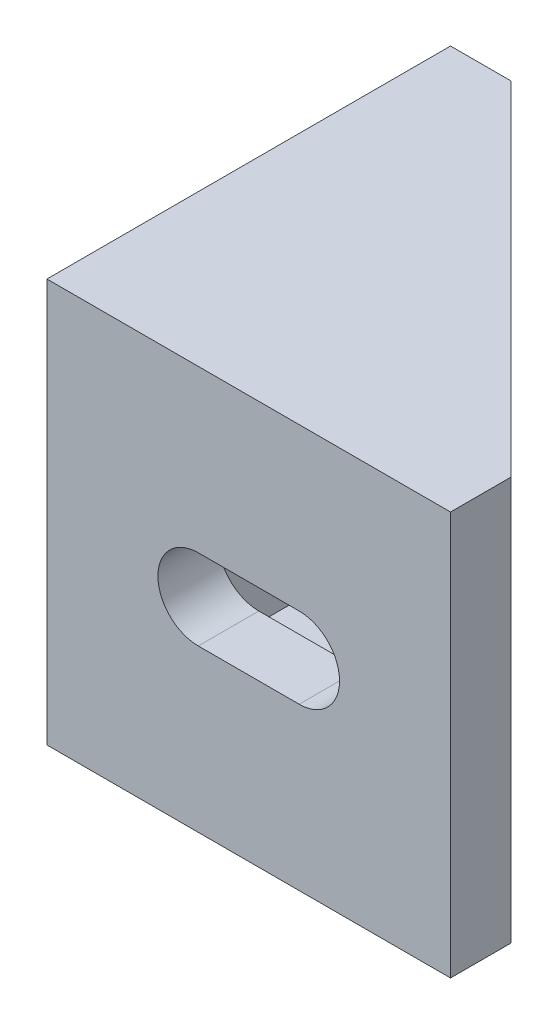
ISO-10303-21;
HEADER;
FILE_DESCRIPTION(('STEP AP214'),'2;1');
FILE_NAME('part.step','',(''),(''),'','','');
FILE_SCHEMA(('AUTOMOTIVE_DESIGN { 1 0 10303 214 1 1 1 1 }'));
ENDSEC;
DATA;
#1=APPLICATION_CONTEXT('core data for automotive mechanical design processes');
#2=APPLICATION_PROTOCOL_DEFINITION('international standard','automotive_design',2000,#1);
#3=PRODUCT_CONTEXT('',#1,'mechanical');
#4=PRODUCT('Part','Part','',(#3));
#5=PRODUCT_RELATED_PRODUCT_CATEGORY('part','',(#4));
#6=PRODUCT_DEFINITION_FORMATION('','',#4);
#7=PRODUCT_DEFINITION_CONTEXT('part definition',#1,'design');
#8=PRODUCT_DEFINITION('design','',#6,#7);
#9=PRODUCT_DEFINITION_SHAPE('','',#8);
#10=(LENGTH_UNIT() NAMED_UNIT(*) SI_UNIT(.MILLI.,.METRE.));
#11=(NAMED_UNIT(*) PLANE_ANGLE_UNIT() SI_UNIT($,.RADIAN.));
#12=(NAMED_UNIT(*) SI_UNIT($,.STERADIAN.) SOLID_ANGLE_UNIT());
#13=UNCERTAINTY_MEASURE_WITH_UNIT(LENGTH_MEASURE(1.E-05),#10,'distance_accuracy_value','');
#14=(GEOMETRIC_REPRESENTATION_CONTEXT(3) GLOBAL_UNCERTAINTY_ASSIGNED_CONTEXT((#13)) GLOBAL_UNIT_ASSIGNED_CONTEXT((#10,
#11,#12)) REPRESENTATION_CONTEXT('',''));
#15=CARTESIAN_POINT('',(0.,0.,0.));
#16=DIRECTION('',(0.,0.,1.));
#17=DIRECTION('',(1.,0.,0.));
#18=AXIS2_PLACEMENT_3D('',#15,#16,#17);
#19=CARTESIAN_POINT('',(3.,20.,0.));
#20=DIRECTION('',(-1.,0.,0.));
#21=DIRECTION('',(0.,0.,1.));
#22=AXIS2_PLACEMENT_3D('',#19,#20,#21);
#23=PLANE('',#22);
#24=DIRECTION('',(0.,0.,-1.));
#25=VECTOR('',#24,1.);
#26=CARTESIAN_POINT('',(3.,8.,-7.5));
#27=LINE('',#26,#25);
#28=CARTESIAN_POINT('',(3.,8.,-7.5));
#29=VERTEX_POINT('',#28);
#30=CARTESIAN_POINT('',(3.,8.,-12.5));
#31=VERTEX_POINT('',#30);
#32=EDGE_CURVE('E172',#29,#31,#27,.T.);
#33=ORIENTED_EDGE('',*,*,#32,.F.);
#34=CARTESIAN_POINT('',(3.,10.,-7.5));
#35=DIRECTION('',(1.,0.,0.));
#36=DIRECTION('',(0.,0.,-1.));
#37=AXIS2_PLACEMENT_3D('',#34,#35,#36);
#38=CIRCLE('',#37,2.);
#39=CARTESIAN_POINT('',(3.,12.,-7.5));
#40=VERTEX_POINT('',#39);
#41=EDGE_CURVE('E48',#40,#29,#38,.T.);
#42=ORIENTED_EDGE('',*,*,#41,.F.);
#43=DIRECTION('',(0.,0.,1.));
#44=VECTOR('',#43,1.);
#45=CARTESIAN_POINT('',(3.,12.,-7.5));
#46=LINE('',#45,#44);
#47=CARTESIAN_POINT('',(3.,12.,-12.5));
#48=VERTEX_POINT('',#47);
#49=EDGE_CURVE('E163',#48,#40,#46,.T.);
#50=ORIENTED_EDGE('',*,*,#49,.F.);
#51=CARTESIAN_POINT('',(3.,10.,-12.5));
#52=DIRECTION('',(1.,0.,0.));
#53=DIRECTION('',(0.,0.,-1.));
#54=AXIS2_PLACEMENT_3D('',#51,#52,#53);
#55=CIRCLE('',#54,2.);
#56=EDGE_CURVE('E166',#31,#48,#55,.T.);
#57=ORIENTED_EDGE('',*,*,#56,.F.);
#58=EDGE_LOOP('',(#33,#42,#50,#57));
#59=FACE_BOUND('',#58,.T.);
#60=DIRECTION('',(0.,0.,1.));
#61=VECTOR('',#60,1.);
#62=CARTESIAN_POINT('',(3.,3.,-20.));
#63=LINE('',#62,#61);
#64=CARTESIAN_POINT('',(3.,3.,-20.));
#65=VERTEX_POINT('',#64);
#66=CARTESIAN_POINT('',(3.,3.,-3.));
#67=VERTEX_POINT('',#66);
#68=EDGE_CURVE('E220',#65,#67,#63,.T.);
#69=ORIENTED_EDGE('',*,*,#68,.F.);
#70=DIRECTION('',(0.,-1.,0.));
#71=VECTOR('',#70,1.);
#72=CARTESIAN_POINT('',(3.,20.,-20.));
#73=LINE('',#72,#71);
#74=CARTESIAN_POINT('',(3.,17.,-20.));
#75=VERTEX_POINT('',#74);
#76=EDGE_CURVE('E273',#75,#65,#73,.T.);
#77=ORIENTED_EDGE('',*,*,#76,.F.);
#78=DIRECTION('',(0.,0.,-1.));
#79=VECTOR('',#78,1.);
#80=CARTESIAN_POINT('',(3.,17.,0.));
#81=LINE('',#80,#79);
#82=CARTESIAN_POINT('',(3.,17.,-3.));
#83=VERTEX_POINT('',#82);
#84=EDGE_CURVE('E235',#83,#75,#81,.T.);
#85=ORIENTED_EDGE('',*,*,#84,.F.);
#86=DIRECTION('',(0.,-1.,0.));
#87=VECTOR('',#86,1.);
#88=CARTESIAN_POINT('',(3.,20.,-3.));
#89=LINE('',#88,#87);
#90=EDGE_CURVE('E253',#83,#67,#89,.T.);
#91=ORIENTED_EDGE('',*,*,#90,.T.);
#92=EDGE_LOOP('',(#69,#77,#85,#91));
#93=FACE_BOUND('',#92,.T.);
#94=ADVANCED_FACE('F34',(#59,#93),#23,.F.);
#95=CARTESIAN_POINT('',(0.,20.,-3.));
#96=DIRECTION('',(0.,0.,1.));
#97=DIRECTION('',(1.,0.,0.));
#98=AXIS2_PLACEMENT_3D('',#95,#96,#97);
#99=PLANE('',#98);
#100=CARTESIAN_POINT('',(12.5,10.,-3.));
#101=DIRECTION('',(0.,0.,-1.));
#102=DIRECTION('',(-1.,0.,0.));
#103=AXIS2_PLACEMENT_3D('',#100,#101,#102);
#104=CIRCLE('',#103,2.);
#105=CARTESIAN_POINT('',(12.5,12.,-3.));
#106=VERTEX_POINT('',#105);
#107=CARTESIAN_POINT('',(12.5,8.,-3.));
#108=VERTEX_POINT('',#107);
#109=EDGE_CURVE('E197',#106,#108,#104,.T.);
#110=ORIENTED_EDGE('',*,*,#109,.F.);
#111=DIRECTION('',(1.,0.,0.));
#112=VECTOR('',#111,1.);
#113=CARTESIAN_POINT('',(7.5,12.,-3.));
#114=LINE('',#113,#112);
#115=CARTESIAN_POINT('',(7.5,12.,-3.));
#116=VERTEX_POINT('',#115);
#117=EDGE_CURVE('E178',#116,#106,#114,.T.);
#118=ORIENTED_EDGE('',*,*,#117,.F.);
#119=CARTESIAN_POINT('',(7.5,10.,-3.));
#120=DIRECTION('',(0.,0.,-1.));
#121=DIRECTION('',(-1.,0.,0.));
#122=AXIS2_PLACEMENT_3D('',#119,#120,#121);
#123=CIRCLE('',#122,2.);
#124=CARTESIAN_POINT('',(7.5,8.,-3.));
#125=VERTEX_POINT('',#124);
#126=EDGE_CURVE('E186',#125,#116,#123,.T.);
#127=ORIENTED_EDGE('',*,*,#126,.F.);
#128=DIRECTION('',(1.,0.,0.));
#129=VECTOR('',#128,1.);
#130=CARTESIAN_POINT('',(7.5,8.,-3.));
#131=LINE('',#130,#129);
#132=EDGE_CURVE('E200',#125,#108,#131,.T.);
#133=ORIENTED_EDGE('',*,*,#132,.T.);
#134=EDGE_LOOP('',(#110,#118,#127,#133));
#135=FACE_BOUND('',#134,.T.);
#136=DIRECTION('',(1.,0.,0.));
#137=VECTOR('',#136,1.);
#138=CARTESIAN_POINT('',(3.,3.,-3.));
#139=LINE('',#138,#137);
#140=CARTESIAN_POINT('',(20.,3.,-3.));
#141=VERTEX_POINT('',#140);
#142=EDGE_CURVE('E214',#67,#141,#139,.T.);
#143=ORIENTED_EDGE('',*,*,#142,.F.);
#144=ORIENTED_EDGE('',*,*,#90,.F.);
#145=DIRECTION('',(-1.,0.,0.));
#146=VECTOR('',#145,1.);
#147=CARTESIAN_POINT('',(0.,17.,-3.));
#148=LINE('',#147,#146);
#149=CARTESIAN_POINT('',(20.,17.,-3.));
#150=VERTEX_POINT('',#149);
#151=EDGE_CURVE('E11',#150,#83,#148,.T.);
#152=ORIENTED_EDGE('',*,*,#151,.F.);
#153=DIRECTION('',(0.,-1.,0.));
#154=VECTOR('',#153,1.);
#155=CARTESIAN_POINT('',(20.,20.,-3.));
#156=LINE('',#155,#154);
#157=EDGE_CURVE('E265',#150,#141,#156,.T.);
#158=ORIENTED_EDGE('',*,*,#157,.T.);
#159=EDGE_LOOP('',(#143,#144,#152,#158));
#160=FACE_BOUND('',#159,.T.);
#161=ADVANCED_FACE('F314',(#135,#160),#99,.F.);
#162=CARTESIAN_POINT('',(0.,20.,-20.));
#163=DIRECTION('',(0.,0.,-1.));
#164=DIRECTION('',(-1.,0.,0.));
#165=AXIS2_PLACEMENT_3D('',#162,#163,#164);
#166=PLANE('',#165);
#167=CARTESIAN_POINT('',(3.,20.,-20.));
#168=VERTEX_POINT('',#167);
#169=EDGE_CURVE('E41',#168,#75,#73,.T.);
#170=ORIENTED_EDGE('',*,*,#169,.T.);
#171=ORIENTED_EDGE('',*,*,#76,.T.);
#172=DIRECTION('',(0.,-1.,0.));
#173=VECTOR('',#172,1.);
#174=CARTESIAN_POINT('',(3.,3.,-20.));
#175=LINE('',#174,#173);
#176=CARTESIAN_POINT('',(3.,0.,-20.));
#177=VERTEX_POINT('',#176);
#178=EDGE_CURVE('E223',#65,#177,#175,.T.);
#179=ORIENTED_EDGE('',*,*,#178,.T.);
#180=DIRECTION('',(1.,0.,0.));
#181=VECTOR('',#180,1.);
#182=CARTESIAN_POINT('',(0.,0.,-20.));
#183=LINE('',#182,#181);
#184=CARTESIAN_POINT('',(0.,0.,-20.));
#185=VERTEX_POINT('',#184);
#186=EDGE_CURVE('E239',#185,#177,#183,.T.);
#187=ORIENTED_EDGE('',*,*,#186,.F.);
#188=DIRECTION('',(0.,-1.,0.));
#189=VECTOR('',#188,1.);
#190=CARTESIAN_POINT('',(0.,20.,-20.));
#191=LINE('',#190,#189);
#192=CARTESIAN_POINT('',(0.,20.,-20.));
#193=VERTEX_POINT('',#192);
#194=EDGE_CURVE('E272',#193,#185,#191,.T.);
#195=ORIENTED_EDGE('',*,*,#194,.F.);
#196=DIRECTION('',(1.,0.,0.));
#197=VECTOR('',#196,1.);
#198=CARTESIAN_POINT('',(0.,20.,-20.));
#199=LINE('',#198,#197);
#200=EDGE_CURVE('E240',#193,#168,#199,.T.);
#201=ORIENTED_EDGE('',*,*,#200,.T.);
#202=EDGE_LOOP('',(#170,#171,#179,#187,#195,#201));
#203=FACE_BOUND('',#202,.T.);
#204=ADVANCED_FACE('F278',(#203),#166,.T.);
#205=CARTESIAN_POINT('',(0.,20.,0.));
#206=DIRECTION('',(-1.,0.,0.));
#207=DIRECTION('',(0.,0.,1.));
#208=AXIS2_PLACEMENT_3D('',#205,#206,#207);
#209=PLANE('',#208);
#210=CARTESIAN_POINT('',(0.,10.,-7.5));
#211=DIRECTION('',(1.,0.,0.));
#212=DIRECTION('',(0.,0.,-1.));
#213=AXIS2_PLACEMENT_3D('',#210,#211,#212);
#214=CIRCLE('',#213,2.);
#215=CARTESIAN_POINT('',(0.,12.,-7.5));
#216=VERTEX_POINT('',#215);
#217=CARTESIAN_POINT('',(0.,8.,-7.5));
#218=VERTEX_POINT('',#217);
#219=EDGE_CURVE('E147',#216,#218,#214,.T.);
#220=ORIENTED_EDGE('',*,*,#219,.T.);
#221=DIRECTION('',(0.,0.,-1.));
#222=VECTOR('',#221,1.);
#223=CARTESIAN_POINT('',(0.,8.,-7.5));
#224=LINE('',#223,#222);
#225=CARTESIAN_POINT('',(0.,8.,-12.5));
#226=VERTEX_POINT('',#225);
#227=EDGE_CURVE('E156',#218,#226,#224,.T.);
#228=ORIENTED_EDGE('',*,*,#227,.T.);
#229=CARTESIAN_POINT('',(0.,10.,-12.5));
#230=DIRECTION('',(1.,0.,0.));
#231=DIRECTION('',(0.,0.,-1.));
#232=AXIS2_PLACEMENT_3D('',#229,#230,#231);
#233=CIRCLE('',#232,2.);
#234=CARTESIAN_POINT('',(0.,12.,-12.5));
#235=VERTEX_POINT('',#234);
#236=EDGE_CURVE('E56',#226,#235,#233,.T.);
#237=ORIENTED_EDGE('',*,*,#236,.T.);
#238=DIRECTION('',(0.,0.,1.));
#239=VECTOR('',#238,1.);
#240=CARTESIAN_POINT('',(0.,12.,-7.5));
#241=LINE('',#240,#239);
#242=EDGE_CURVE('E153',#235,#216,#241,.T.);
#243=ORIENTED_EDGE('',*,*,#242,.T.);
#244=EDGE_LOOP('',(#220,#228,#237,#243));
#245=FACE_BOUND('',#244,.T.);
#246=ORIENTED_EDGE('',*,*,#194,.T.);
#247=DIRECTION('',(0.,0.,-1.));
#248=VECTOR('',#247,1.);
#249=CARTESIAN_POINT('',(0.,0.,0.));
#250=LINE('',#249,#248);
#251=CARTESIAN_POINT('',(0.,0.,0.));
#252=VERTEX_POINT('',#251);
#253=EDGE_CURVE('E255',#252,#185,#250,.T.);
#254=ORIENTED_EDGE('',*,*,#253,.F.);
#255=DIRECTION('',(0.,-1.,0.));
#256=VECTOR('',#255,1.);
#257=CARTESIAN_POINT('',(0.,20.,0.));
#258=LINE('',#257,#256);
#259=CARTESIAN_POINT('',(0.,20.,0.));
#260=VERTEX_POINT('',#259);
#261=EDGE_CURVE('E270',#260,#252,#258,.T.);
#262=ORIENTED_EDGE('',*,*,#261,.F.);
#263=DIRECTION('',(0.,0.,-1.));
#264=VECTOR('',#263,1.);
#265=CARTESIAN_POINT('',(0.,20.,0.));
#266=LINE('',#265,#264);
#267=EDGE_CURVE('E243',#260,#193,#266,.T.);
#268=ORIENTED_EDGE('',*,*,#267,.T.);
#269=EDGE_LOOP('',(#246,#254,#262,#268));
#270=FACE_BOUND('',#269,.T.);
#271=ADVANCED_FACE('F160',(#245,#270),#209,.T.);
#272=CARTESIAN_POINT('',(0.,20.,0.));
#273=DIRECTION('',(0.,0.,1.));
#274=DIRECTION('',(1.,0.,0.));
#275=AXIS2_PLACEMENT_3D('',#272,#273,#274);
#276=PLANE('',#275);
#277=DIRECTION('',(1.,0.,0.));
#278=VECTOR('',#277,1.);
#279=CARTESIAN_POINT('',(7.5,12.,0.));
#280=LINE('',#279,#278);
#281=CARTESIAN_POINT('',(7.5,12.,0.));
#282=VERTEX_POINT('',#281);
#283=CARTESIAN_POINT('',(12.5,12.,0.));
#284=VERTEX_POINT('',#283);
#285=EDGE_CURVE('E182',#282,#284,#280,.T.);
#286=ORIENTED_EDGE('',*,*,#285,.T.);
#287=CARTESIAN_POINT('',(12.5,10.,0.));
#288=DIRECTION('',(0.,0.,-1.));
#289=DIRECTION('',(-1.,0.,0.));
#290=AXIS2_PLACEMENT_3D('',#287,#288,#289);
#291=CIRCLE('',#290,2.);
#292=CARTESIAN_POINT('',(12.5,8.,0.));
#293=VERTEX_POINT('',#292);
#294=EDGE_CURVE('E185',#284,#293,#291,.T.);
#295=ORIENTED_EDGE('',*,*,#294,.T.);
#296=DIRECTION('',(1.,0.,0.));
#297=VECTOR('',#296,1.);
#298=CARTESIAN_POINT('',(7.5,8.,0.));
#299=LINE('',#298,#297);
#300=CARTESIAN_POINT('',(7.5,8.,0.));
#301=VERTEX_POINT('',#300);
#302=EDGE_CURVE('E189',#301,#293,#299,.T.);
#303=ORIENTED_EDGE('',*,*,#302,.F.);
#304=CARTESIAN_POINT('',(7.5,10.,0.));
#305=DIRECTION('',(0.,0.,-1.));
#306=DIRECTION('',(-1.,0.,0.));
#307=AXIS2_PLACEMENT_3D('',#304,#305,#306);
#308=CIRCLE('',#307,2.);
#309=EDGE_CURVE('E192',#301,#282,#308,.T.);
#310=ORIENTED_EDGE('',*,*,#309,.T.);
#311=EDGE_LOOP('',(#286,#295,#303,#310));
#312=FACE_BOUND('',#311,.T.);
#313=ORIENTED_EDGE('',*,*,#261,.T.);
#314=DIRECTION('',(-1.,0.,0.));
#315=VECTOR('',#314,1.);
#316=CARTESIAN_POINT('',(0.,0.,0.));
#317=LINE('',#316,#315);
#318=CARTESIAN_POINT('',(20.,0.,0.));
#319=VERTEX_POINT('',#318);
#320=EDGE_CURVE('E258',#319,#252,#317,.T.);
#321=ORIENTED_EDGE('',*,*,#320,.F.);
#322=DIRECTION('',(0.,-1.,0.));
#323=VECTOR('',#322,1.);
#324=CARTESIAN_POINT('',(20.,20.,0.));
#325=LINE('',#324,#323);
#326=CARTESIAN_POINT('',(20.,20.,0.));
#327=VERTEX_POINT('',#326);
#328=EDGE_CURVE('E268',#327,#319,#325,.T.);
#329=ORIENTED_EDGE('',*,*,#328,.F.);
#330=DIRECTION('',(-1.,0.,0.));
#331=VECTOR('',#330,1.);
#332=CARTESIAN_POINT('',(0.,20.,0.));
#333=LINE('',#332,#331);
#334=EDGE_CURVE('E247',#327,#260,#333,.T.);
#335=ORIENTED_EDGE('',*,*,#334,.T.);
#336=EDGE_LOOP('',(#313,#321,#329,#335));
#337=FACE_BOUND('',#336,.T.);
#338=ADVANCED_FACE('F300',(#312,#337),#276,.T.);
#339=CARTESIAN_POINT('',(20.,20.,-3.));
#340=DIRECTION('',(1.,0.,0.));
#341=DIRECTION('',(0.,0.,-1.));
#342=AXIS2_PLACEMENT_3D('',#339,#340,#341);
#343=PLANE('',#342);
#344=ORIENTED_EDGE('',*,*,#328,.T.);
#345=DIRECTION('',(0.,0.,1.));
#346=VECTOR('',#345,1.);
#347=CARTESIAN_POINT('',(20.,0.,-3.));
#348=LINE('',#347,#346);
#349=CARTESIAN_POINT('',(20.,0.,-3.));
#350=VERTEX_POINT('',#349);
#351=EDGE_CURVE('E244',#350,#319,#348,.T.);
#352=ORIENTED_EDGE('',*,*,#351,.F.);
#353=DIRECTION('',(0.,-1.,0.));
#354=VECTOR('',#353,1.);
#355=CARTESIAN_POINT('',(20.,3.,-3.));
#356=LINE('',#355,#354);
#357=EDGE_CURVE('E228',#141,#350,#356,.T.);
#358=ORIENTED_EDGE('',*,*,#357,.F.);
#359=ORIENTED_EDGE('',*,*,#157,.F.);
#360=CARTESIAN_POINT('',(20.,20.,-3.));
#361=VERTEX_POINT('',#360);
#362=EDGE_CURVE('E266',#361,#150,#156,.T.);
#363=ORIENTED_EDGE('',*,*,#362,.F.);
#364=DIRECTION('',(0.,0.,1.));
#365=VECTOR('',#364,1.);
#366=CARTESIAN_POINT('',(20.,20.,-3.));
#367=LINE('',#366,#365);
#368=EDGE_CURVE('E250',#361,#327,#367,.T.);
#369=ORIENTED_EDGE('',*,*,#368,.T.);
#370=EDGE_LOOP('',(#344,#352,#358,#359,#363,#369));
#371=FACE_BOUND('',#370,.T.);
#372=ADVANCED_FACE('F303',(#371),#343,.T.);
#373=CARTESIAN_POINT('',(0.,20.,0.));
#374=DIRECTION('',(0.,-1.,0.));
#375=DIRECTION('',(-1.,0.,0.));
#376=AXIS2_PLACEMENT_3D('',#373,#374,#375);
#377=PLANE('',#376);
#378=DIRECTION('',(-0.707106781186547,0.,-0.707106781186547));
#379=VECTOR('',#378,1.);
#380=CARTESIAN_POINT('',(3.,20.,-20.));
#381=LINE('',#380,#379);
#382=EDGE_CURVE('E231',#361,#168,#381,.T.);
#383=ORIENTED_EDGE('',*,*,#382,.T.);
#384=ORIENTED_EDGE('',*,*,#200,.F.);
#385=ORIENTED_EDGE('',*,*,#267,.F.);
#386=ORIENTED_EDGE('',*,*,#334,.F.);
#387=ORIENTED_EDGE('',*,*,#368,.F.);
#388=EDGE_LOOP('',(#383,#384,#385,#386,#387));
#389=FACE_BOUND('',#388,.T.);
#390=ADVANCED_FACE('F295',(#389),#377,.F.);
#391=CARTESIAN_POINT('',(0.,0.,0.));
#392=DIRECTION('',(0.,-1.,0.));
#393=DIRECTION('',(-1.,0.,0.));
#394=AXIS2_PLACEMENT_3D('',#391,#392,#393);
#395=PLANE('',#394);
#396=ORIENTED_EDGE('',*,*,#186,.T.);
#397=DIRECTION('',(-0.707106781186547,0.,-0.707106781186547));
#398=VECTOR('',#397,1.);
#399=CARTESIAN_POINT('',(20.,0.,-3.));
#400=LINE('',#399,#398);
#401=EDGE_CURVE('E207',#350,#177,#400,.T.);
#402=ORIENTED_EDGE('',*,*,#401,.F.);
#403=ORIENTED_EDGE('',*,*,#351,.T.);
#404=ORIENTED_EDGE('',*,*,#320,.T.);
#405=ORIENTED_EDGE('',*,*,#253,.T.);
#406=EDGE_LOOP('',(#396,#402,#403,#404,#405));
#407=FACE_BOUND('',#406,.T.);
#408=ADVANCED_FACE('F290',(#407),#395,.T.);
#409=CARTESIAN_POINT('',(0.,17.,0.));
#410=DIRECTION('',(0.,1.,0.));
#411=DIRECTION('',(0.,0.,1.));
#412=AXIS2_PLACEMENT_3D('',#409,#410,#411);
#413=PLANE('',#412);
#414=ORIENTED_EDGE('',*,*,#151,.T.);
#415=ORIENTED_EDGE('',*,*,#84,.T.);
#416=DIRECTION('',(-0.707106781186547,0.,-0.707106781186547));
#417=VECTOR('',#416,1.);
#418=CARTESIAN_POINT('',(3.,17.,-20.));
#419=LINE('',#418,#417);
#420=EDGE_CURVE('E232',#150,#75,#419,.T.);
#421=ORIENTED_EDGE('',*,*,#420,.F.);
#422=EDGE_LOOP('',(#414,#415,#421));
#423=FACE_BOUND('',#422,.T.);
#424=ADVANCED_FACE('F311',(#423),#413,.F.);
#425=CARTESIAN_POINT('',(3.,17.,-20.));
#426=DIRECTION('',(0.707106781186548,0.,-0.707106781186548));
#427=DIRECTION('',(-0.707106781186548,0.,-0.707106781186548));
#428=AXIS2_PLACEMENT_3D('',#425,#426,#427);
#429=PLANE('',#428);
#430=ORIENTED_EDGE('',*,*,#382,.F.);
#431=ORIENTED_EDGE('',*,*,#362,.T.);
#432=ORIENTED_EDGE('',*,*,#420,.T.);
#433=ORIENTED_EDGE('',*,*,#169,.F.);
#434=EDGE_LOOP('',(#430,#431,#432,#433));
#435=FACE_BOUND('',#434,.T.);
#436=ADVANCED_FACE('F308',(#435),#429,.T.);
#437=CARTESIAN_POINT('',(20.,3.,-3.));
#438=DIRECTION('',(-0.707106781186548,0.,0.707106781186548));
#439=DIRECTION('',(0.707106781186548,0.,0.707106781186548));
#440=AXIS2_PLACEMENT_3D('',#437,#438,#439);
#441=PLANE('',#440);
#442=ORIENTED_EDGE('',*,*,#401,.T.);
#443=ORIENTED_EDGE('',*,*,#178,.F.);
#444=DIRECTION('',(-0.707106781186547,0.,-0.707106781186547));
#445=VECTOR('',#444,1.);
#446=CARTESIAN_POINT('',(20.,3.,-3.));
#447=LINE('',#446,#445);
#448=EDGE_CURVE('E217',#141,#65,#447,.T.);
#449=ORIENTED_EDGE('',*,*,#448,.F.);
#450=ORIENTED_EDGE('',*,*,#357,.T.);
#451=EDGE_LOOP('',(#442,#443,#449,#450));
#452=FACE_BOUND('',#451,.T.);
#453=ADVANCED_FACE('F287',(#452),#441,.F.);
#454=CARTESIAN_POINT('',(0.,3.,0.));
#455=DIRECTION('',(0.,-1.,0.));
#456=DIRECTION('',(0.,0.,-1.));
#457=AXIS2_PLACEMENT_3D('',#454,#455,#456);
#458=PLANE('',#457);
#459=ORIENTED_EDGE('',*,*,#142,.T.);
#460=ORIENTED_EDGE('',*,*,#448,.T.);
#461=ORIENTED_EDGE('',*,*,#68,.T.);
#462=EDGE_LOOP('',(#459,#460,#461));
#463=FACE_BOUND('',#462,.T.);
#464=ADVANCED_FACE('F285',(#463),#458,.F.);
#465=CARTESIAN_POINT('',(7.5,12.,0.));
#466=DIRECTION('',(0.,1.,0.));
#467=DIRECTION('',(-1.,0.,0.));
#468=AXIS2_PLACEMENT_3D('',#465,#466,#467);
#469=PLANE('',#468);
#470=ORIENTED_EDGE('',*,*,#117,.T.);
#471=DIRECTION('',(0.,0.,-1.));
#472=VECTOR('',#471,1.);
#473=CARTESIAN_POINT('',(12.5,12.,0.));
#474=LINE('',#473,#472);
#475=EDGE_CURVE('E195',#284,#106,#474,.T.);
#476=ORIENTED_EDGE('',*,*,#475,.F.);
#477=ORIENTED_EDGE('',*,*,#285,.F.);
#478=DIRECTION('',(0.,0.,-1.));
#479=VECTOR('',#478,1.);
#480=CARTESIAN_POINT('',(7.5,12.,0.));
#481=LINE('',#480,#479);
#482=EDGE_CURVE('E205',#282,#116,#481,.T.);
#483=ORIENTED_EDGE('',*,*,#482,.T.);
#484=EDGE_LOOP('',(#470,#476,#477,#483));
#485=FACE_BOUND('',#484,.T.);
#486=ADVANCED_FACE('F343',(#485),#469,.F.);
#487=CARTESIAN_POINT('',(7.5,10.,0.));
#488=DIRECTION('',(0.,0.,-1.));
#489=DIRECTION('',(-1.,0.,0.));
#490=AXIS2_PLACEMENT_3D('',#487,#488,#489);
#491=CYLINDRICAL_SURFACE('',#490,2.);
#492=ORIENTED_EDGE('',*,*,#126,.T.);
#493=ORIENTED_EDGE('',*,*,#482,.F.);
#494=ORIENTED_EDGE('',*,*,#309,.F.);
#495=DIRECTION('',(0.,0.,-1.));
#496=VECTOR('',#495,1.);
#497=CARTESIAN_POINT('',(7.5,8.,0.));
#498=LINE('',#497,#496);
#499=EDGE_CURVE('E208',#301,#125,#498,.T.);
#500=ORIENTED_EDGE('',*,*,#499,.T.);
#501=EDGE_LOOP('',(#492,#493,#494,#500));
#502=FACE_BOUND('',#501,.T.);
#503=ADVANCED_FACE('F339',(#502),#491,.F.);
#504=CARTESIAN_POINT('',(7.5,8.,0.));
#505=DIRECTION('',(0.,1.,0.));
#506=DIRECTION('',(-1.,0.,0.));
#507=AXIS2_PLACEMENT_3D('',#504,#505,#506);
#508=PLANE('',#507);
#509=ORIENTED_EDGE('',*,*,#132,.F.);
#510=ORIENTED_EDGE('',*,*,#499,.F.);
#511=ORIENTED_EDGE('',*,*,#302,.T.);
#512=DIRECTION('',(0.,0.,-1.));
#513=VECTOR('',#512,1.);
#514=CARTESIAN_POINT('',(12.5,8.,0.));
#515=LINE('',#514,#513);
#516=EDGE_CURVE('E210',#293,#108,#515,.T.);
#517=ORIENTED_EDGE('',*,*,#516,.T.);
#518=EDGE_LOOP('',(#509,#510,#511,#517));
#519=FACE_BOUND('',#518,.T.);
#520=ADVANCED_FACE('F342',(#519),#508,.T.);
#521=CARTESIAN_POINT('',(12.5,10.,0.));
#522=DIRECTION('',(0.,0.,-1.));
#523=DIRECTION('',(-1.,0.,0.));
#524=AXIS2_PLACEMENT_3D('',#521,#522,#523);
#525=CYLINDRICAL_SURFACE('',#524,2.);
#526=ORIENTED_EDGE('',*,*,#109,.T.);
#527=ORIENTED_EDGE('',*,*,#516,.F.);
#528=ORIENTED_EDGE('',*,*,#294,.F.);
#529=ORIENTED_EDGE('',*,*,#475,.T.);
#530=EDGE_LOOP('',(#526,#527,#528,#529));
#531=FACE_BOUND('',#530,.T.);
#532=ADVANCED_FACE('F334',(#531),#525,.F.);
#533=CARTESIAN_POINT('',(0.,10.,-7.5));
#534=DIRECTION('',(1.,0.,0.));
#535=DIRECTION('',(0.,0.,-1.));
#536=AXIS2_PLACEMENT_3D('',#533,#534,#535);
#537=CYLINDRICAL_SURFACE('',#536,2.);
#538=ORIENTED_EDGE('',*,*,#41,.T.);
#539=DIRECTION('',(1.,0.,0.));
#540=VECTOR('',#539,1.);
#541=CARTESIAN_POINT('',(0.,8.,-7.5));
#542=LINE('',#541,#540);
#543=EDGE_CURVE('E143',#218,#29,#542,.T.);
#544=ORIENTED_EDGE('',*,*,#543,.F.);
#545=ORIENTED_EDGE('',*,*,#219,.F.);
#546=DIRECTION('',(1.,0.,0.));
#547=VECTOR('',#546,1.);
#548=CARTESIAN_POINT('',(0.,12.,-7.5));
#549=LINE('',#548,#547);
#550=EDGE_CURVE('E176',#216,#40,#549,.T.);
#551=ORIENTED_EDGE('',*,*,#550,.T.);
#552=EDGE_LOOP('',(#538,#544,#545,#551));
#553=FACE_BOUND('',#552,.T.);
#554=ADVANCED_FACE('F145',(#553),#537,.F.);
#555=CARTESIAN_POINT('',(0.,12.,-7.5));
#556=DIRECTION('',(0.,1.,0.));
#557=DIRECTION('',(0.,0.,1.));
#558=AXIS2_PLACEMENT_3D('',#555,#556,#557);
#559=PLANE('',#558);
#560=ORIENTED_EDGE('',*,*,#49,.T.);
#561=ORIENTED_EDGE('',*,*,#550,.F.);
#562=ORIENTED_EDGE('',*,*,#242,.F.);
#563=DIRECTION('',(1.,0.,0.));
#564=VECTOR('',#563,1.);
#565=CARTESIAN_POINT('',(0.,12.,-12.5));
#566=LINE('',#565,#564);
#567=EDGE_CURVE('E179',#235,#48,#566,.T.);
#568=ORIENTED_EDGE('',*,*,#567,.T.);
#569=EDGE_LOOP('',(#560,#561,#562,#568));
#570=FACE_BOUND('',#569,.T.);
#571=ADVANCED_FACE('F326',(#570),#559,.F.);
#572=CARTESIAN_POINT('',(0.,10.,-12.5));
#573=DIRECTION('',(1.,0.,0.));
#574=DIRECTION('',(0.,0.,-1.));
#575=AXIS2_PLACEMENT_3D('',#572,#573,#574);
#576=CYLINDRICAL_SURFACE('',#575,2.);
#577=ORIENTED_EDGE('',*,*,#56,.T.);
#578=ORIENTED_EDGE('',*,*,#567,.F.);
#579=ORIENTED_EDGE('',*,*,#236,.F.);
#580=DIRECTION('',(1.,0.,0.));
#581=VECTOR('',#580,1.);
#582=CARTESIAN_POINT('',(0.,8.,-12.5));
#583=LINE('',#582,#581);
#584=EDGE_CURVE('E152',#226,#31,#583,.T.);
#585=ORIENTED_EDGE('',*,*,#584,.T.);
#586=EDGE_LOOP('',(#577,#578,#579,#585));
#587=FACE_BOUND('',#586,.T.);
#588=ADVANCED_FACE('F324',(#587),#576,.F.);
#589=CARTESIAN_POINT('',(0.,8.,-7.5));
#590=DIRECTION('',(0.,-1.,0.));
#591=DIRECTION('',(0.,0.,-1.));
#592=AXIS2_PLACEMENT_3D('',#589,#590,#591);
#593=PLANE('',#592);
#594=ORIENTED_EDGE('',*,*,#32,.T.);
#595=ORIENTED_EDGE('',*,*,#584,.F.);
#596=ORIENTED_EDGE('',*,*,#227,.F.);
#597=ORIENTED_EDGE('',*,*,#543,.T.);
#598=EDGE_LOOP('',(#594,#595,#596,#597));
#599=FACE_BOUND('',#598,.T.);
#600=ADVANCED_FACE('F157',(#599),#593,.F.);
#601=CLOSED_SHELL('',(#94,#161,#204,#271,#338,#372,#390,#408,#424,#436,#453,#464,#486,#503,#520,
#532,#554,#571,#588,#600));
#602=MANIFOLD_SOLID_BREP('B2',#601);
#603=ADVANCED_BREP_SHAPE_REPRESENTATION('',(#18,#602),#14);
#604=SHAPE_DEFINITION_REPRESENTATION(#9,#603);
ENDSEC;
END-ISO-10303-21;
